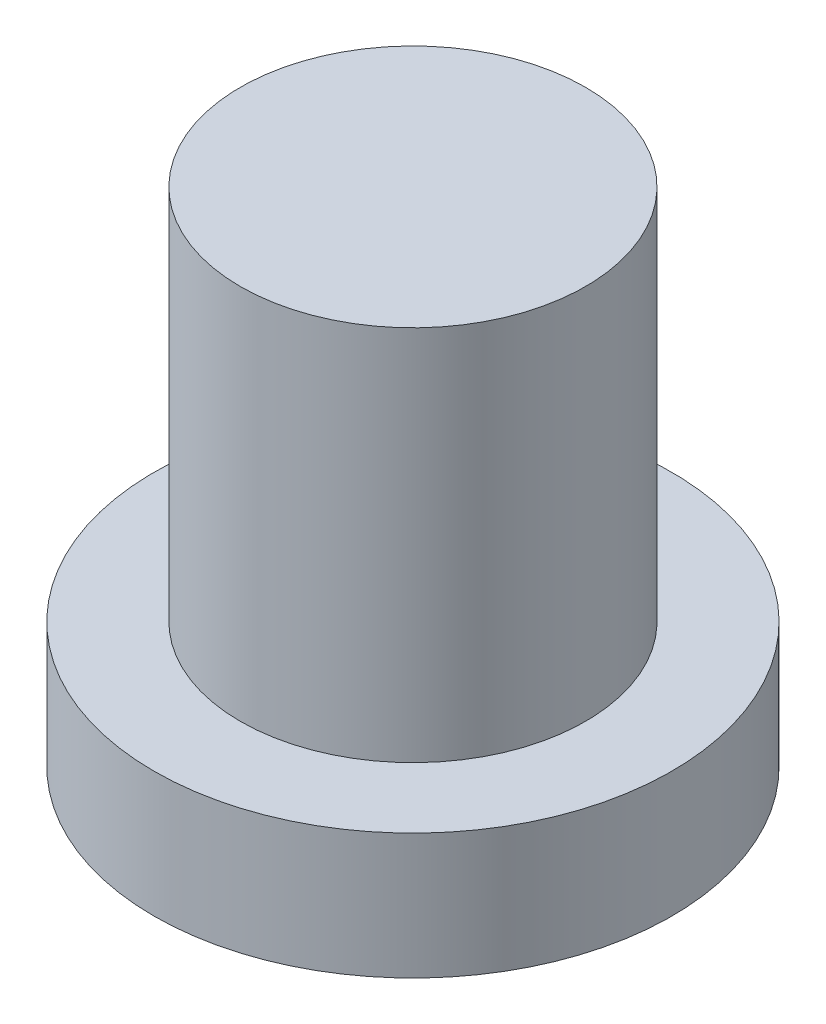
ISO-10303-21;
HEADER;
FILE_DESCRIPTION(('STEP AP214'),'2;1');
FILE_NAME('part.step','',(''),(''),'','','');
FILE_SCHEMA(('AUTOMOTIVE_DESIGN { 1 0 10303 214 1 1 1 1 }'));
ENDSEC;
DATA;
#1=APPLICATION_CONTEXT('core data for automotive mechanical design processes');
#2=APPLICATION_PROTOCOL_DEFINITION('international standard','automotive_design',2000,#1);
#3=PRODUCT_CONTEXT('',#1,'mechanical');
#4=PRODUCT('Part','Part','',(#3));
#5=PRODUCT_RELATED_PRODUCT_CATEGORY('part','',(#4));
#6=PRODUCT_DEFINITION_FORMATION('','',#4);
#7=PRODUCT_DEFINITION_CONTEXT('part definition',#1,'design');
#8=PRODUCT_DEFINITION('design','',#6,#7);
#9=PRODUCT_DEFINITION_SHAPE('','',#8);
#10=(LENGTH_UNIT() NAMED_UNIT(*) SI_UNIT(.MILLI.,.METRE.));
#11=(NAMED_UNIT(*) PLANE_ANGLE_UNIT() SI_UNIT($,.RADIAN.));
#12=(NAMED_UNIT(*) SI_UNIT($,.STERADIAN.) SOLID_ANGLE_UNIT());
#13=UNCERTAINTY_MEASURE_WITH_UNIT(LENGTH_MEASURE(1.E-05),#10,'distance_accuracy_value','');
#14=(GEOMETRIC_REPRESENTATION_CONTEXT(3) GLOBAL_UNCERTAINTY_ASSIGNED_CONTEXT((#13)) GLOBAL_UNIT_ASSIGNED_CONTEXT((#10,
#11,#12)) REPRESENTATION_CONTEXT('',''));
#15=CARTESIAN_POINT('',(0.,0.,0.));
#16=DIRECTION('',(0.,0.,1.));
#17=DIRECTION('',(1.,0.,0.));
#18=AXIS2_PLACEMENT_3D('',#15,#16,#17);
#19=CARTESIAN_POINT('',(0.,1.,0.));
#20=DIRECTION('',(0.,-1.,0.));
#21=DIRECTION('',(0.,0.,-1.));
#22=AXIS2_PLACEMENT_3D('',#19,#20,#21);
#23=CYLINDRICAL_SURFACE('',#22,2.0625);
#24=CARTESIAN_POINT('',(0.,1.,0.));
#25=DIRECTION('',(0.,1.,0.));
#26=DIRECTION('',(0.,0.,1.));
#27=AXIS2_PLACEMENT_3D('',#24,#25,#26);
#28=CIRCLE('',#27,2.0625);
#29=CARTESIAN_POINT('',(0.,1.,2.0625));
#30=VERTEX_POINT('',#29);
#31=EDGE_CURVE('E10',#30,#30,#28,.T.);
#32=ORIENTED_EDGE('',*,*,#31,.F.);
#33=EDGE_LOOP('',(#32));
#34=FACE_BOUND('',#33,.T.);
#35=CARTESIAN_POINT('',(0.,0.,0.));
#36=DIRECTION('',(0.,1.,0.));
#37=DIRECTION('',(0.,0.,1.));
#38=AXIS2_PLACEMENT_3D('',#35,#36,#37);
#39=CIRCLE('',#38,2.0625);
#40=CARTESIAN_POINT('',(0.,0.,2.0625));
#41=VERTEX_POINT('',#40);
#42=EDGE_CURVE('E38',#41,#41,#39,.T.);
#43=ORIENTED_EDGE('',*,*,#42,.T.);
#44=EDGE_LOOP('',(#43));
#45=FACE_BOUND('',#44,.T.);
#46=ADVANCED_FACE('F35',(#34,#45),#23,.T.);
#47=CARTESIAN_POINT('',(0.,1.,0.));
#48=DIRECTION('',(0.,1.,0.));
#49=DIRECTION('',(0.,0.,1.));
#50=AXIS2_PLACEMENT_3D('',#47,#48,#49);
#51=PLANE('',#50);
#52=CARTESIAN_POINT('',(0.,1.,0.));
#53=DIRECTION('',(0.,1.,0.));
#54=DIRECTION('',(0.,0.,1.));
#55=AXIS2_PLACEMENT_3D('',#52,#53,#54);
#56=CIRCLE('',#55,1.375);
#57=CARTESIAN_POINT('',(0.,1.,1.375));
#58=VERTEX_POINT('',#57);
#59=EDGE_CURVE('E47',#58,#58,#56,.T.);
#60=ORIENTED_EDGE('',*,*,#59,.F.);
#61=EDGE_LOOP('',(#60));
#62=FACE_BOUND('',#61,.T.);
#63=ORIENTED_EDGE('',*,*,#31,.T.);
#64=EDGE_LOOP('',(#63));
#65=FACE_BOUND('',#64,.T.);
#66=ADVANCED_FACE('F62',(#62,#65),#51,.T.);
#67=CARTESIAN_POINT('',(0.,0.,0.));
#68=DIRECTION('',(0.,1.,0.));
#69=DIRECTION('',(0.,0.,1.));
#70=AXIS2_PLACEMENT_3D('',#67,#68,#69);
#71=PLANE('',#70);
#72=ORIENTED_EDGE('',*,*,#42,.F.);
#73=EDGE_LOOP('',(#72));
#74=FACE_BOUND('',#73,.T.);
#75=ADVANCED_FACE('F58',(#74),#71,.F.);
#76=CARTESIAN_POINT('',(0.,4.,0.));
#77=DIRECTION('',(0.,-1.,0.));
#78=DIRECTION('',(0.,0.,-1.));
#79=AXIS2_PLACEMENT_3D('',#76,#77,#78);
#80=CYLINDRICAL_SURFACE('',#79,1.375);
#81=CARTESIAN_POINT('',(0.,4.,0.));
#82=DIRECTION('',(0.,1.,0.));
#83=DIRECTION('',(0.,0.,1.));
#84=AXIS2_PLACEMENT_3D('',#81,#82,#83);
#85=CIRCLE('',#84,1.375);
#86=CARTESIAN_POINT('',(0.,4.,1.375));
#87=VERTEX_POINT('',#86);
#88=EDGE_CURVE('E45',#87,#87,#85,.T.);
#89=ORIENTED_EDGE('',*,*,#88,.F.);
#90=EDGE_LOOP('',(#89));
#91=FACE_BOUND('',#90,.T.);
#92=ORIENTED_EDGE('',*,*,#59,.T.);
#93=EDGE_LOOP('',(#92));
#94=FACE_BOUND('',#93,.T.);
#95=ADVANCED_FACE('F55',(#91,#94),#80,.T.);
#96=CARTESIAN_POINT('',(0.,4.,0.));
#97=DIRECTION('',(0.,1.,0.));
#98=DIRECTION('',(0.,0.,1.));
#99=AXIS2_PLACEMENT_3D('',#96,#97,#98);
#100=PLANE('',#99);
#101=ORIENTED_EDGE('',*,*,#88,.T.);
#102=EDGE_LOOP('',(#101));
#103=FACE_BOUND('',#102,.T.);
#104=ADVANCED_FACE('F53',(#103),#100,.T.);
#105=CLOSED_SHELL('',(#46,#66,#75,#95,#104));
#106=MANIFOLD_SOLID_BREP('B2',#105);
#107=ADVANCED_BREP_SHAPE_REPRESENTATION('',(#18,#106),#14);
#108=SHAPE_DEFINITION_REPRESENTATION(#9,#107);
ENDSEC;
END-ISO-10303-21;
